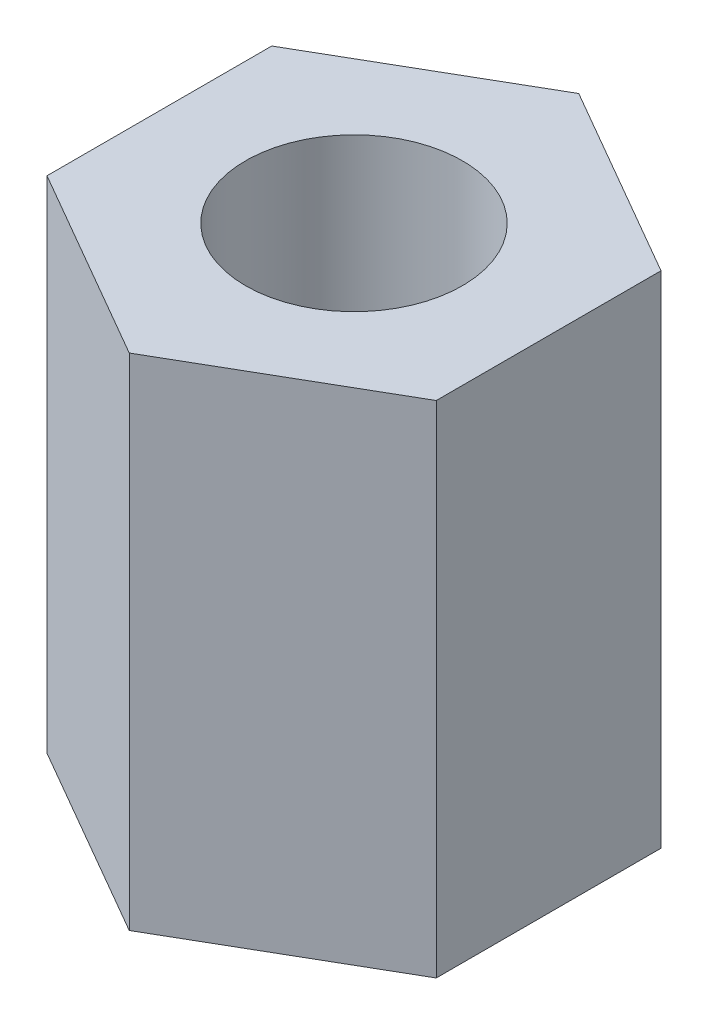
ISO-10303-21;
HEADER;
FILE_DESCRIPTION(('STEP AP214'),'2;1');
FILE_NAME('part.step','',(''),(''),'','','');
FILE_SCHEMA(('AUTOMOTIVE_DESIGN { 1 0 10303 214 1 1 1 1 }'));
ENDSEC;
DATA;
#1=APPLICATION_CONTEXT('core data for automotive mechanical design processes');
#2=APPLICATION_PROTOCOL_DEFINITION('international standard','automotive_design',2000,#1);
#3=PRODUCT_CONTEXT('',#1,'mechanical');
#4=PRODUCT('Part','Part','',(#3));
#5=PRODUCT_RELATED_PRODUCT_CATEGORY('part','',(#4));
#6=PRODUCT_DEFINITION_FORMATION('','',#4);
#7=PRODUCT_DEFINITION_CONTEXT('part definition',#1,'design');
#8=PRODUCT_DEFINITION('design','',#6,#7);
#9=PRODUCT_DEFINITION_SHAPE('','',#8);
#10=(LENGTH_UNIT() NAMED_UNIT(*) SI_UNIT(.MILLI.,.METRE.));
#11=(NAMED_UNIT(*) PLANE_ANGLE_UNIT() SI_UNIT($,.RADIAN.));
#12=(NAMED_UNIT(*) SI_UNIT($,.STERADIAN.) SOLID_ANGLE_UNIT());
#13=UNCERTAINTY_MEASURE_WITH_UNIT(LENGTH_MEASURE(1.E-05),#10,'distance_accuracy_value','');
#14=(GEOMETRIC_REPRESENTATION_CONTEXT(3) GLOBAL_UNCERTAINTY_ASSIGNED_CONTEXT((#13)) GLOBAL_UNIT_ASSIGNED_CONTEXT((#10,
#11,#12)) REPRESENTATION_CONTEXT('',''));
#15=CARTESIAN_POINT('',(0.,0.,0.));
#16=DIRECTION('',(0.,0.,1.));
#17=DIRECTION('',(1.,0.,0.));
#18=AXIS2_PLACEMENT_3D('',#15,#16,#17);
#19=CARTESIAN_POINT('',(0.,6.,0.));
#20=DIRECTION('',(0.,1.,0.));
#21=DIRECTION('',(0.,0.,1.));
#22=AXIS2_PLACEMENT_3D('',#19,#20,#21);
#23=PLANE('',#22);
#24=DIRECTION('',(0.866025403784442,0.,0.499999999999995));
#25=VECTOR('',#24,1.);
#26=CARTESIAN_POINT('',(-2.33499999999999,6.,1.3481128785578));
#27=LINE('',#26,#25);
#28=CARTESIAN_POINT('',(-2.33499999999999,6.,1.3481128785578));
#29=VERTEX_POINT('',#28);
#30=CARTESIAN_POINT('',(0.,6.,2.69622575711555));
#31=VERTEX_POINT('',#30);
#32=EDGE_CURVE('E129',#29,#31,#27,.T.);
#33=ORIENTED_EDGE('',*,*,#32,.T.);
#34=DIRECTION('',(0.866025403784438,0.,-0.500000000000001));
#35=VECTOR('',#34,1.);
#36=CARTESIAN_POINT('',(0.,6.,2.69622575711555));
#37=LINE('',#36,#35);
#38=CARTESIAN_POINT('',(2.335,6.,1.34811287855777));
#39=VERTEX_POINT('',#38);
#40=EDGE_CURVE('E87',#31,#39,#37,.T.);
#41=ORIENTED_EDGE('',*,*,#40,.T.);
#42=DIRECTION('',(0.,0.,-1.));
#43=VECTOR('',#42,1.);
#44=CARTESIAN_POINT('',(2.335,6.,1.34811287855777));
#45=LINE('',#44,#43);
#46=CARTESIAN_POINT('',(2.335,6.,-1.34811287855779));
#47=VERTEX_POINT('',#46);
#48=EDGE_CURVE('E100',#39,#47,#45,.T.);
#49=ORIENTED_EDGE('',*,*,#48,.T.);
#50=DIRECTION('',(-0.866025403784442,0.,-0.499999999999995));
#51=VECTOR('',#50,1.);
#52=CARTESIAN_POINT('',(2.335,6.,-1.34811287855779));
#53=LINE('',#52,#51);
#54=CARTESIAN_POINT('',(0.,6.,-2.69622575711555));
#55=VERTEX_POINT('',#54);
#56=EDGE_CURVE('E94',#47,#55,#53,.T.);
#57=ORIENTED_EDGE('',*,*,#56,.T.);
#58=DIRECTION('',(-0.866025403784434,0.,0.500000000000007));
#59=VECTOR('',#58,1.);
#60=CARTESIAN_POINT('',(0.,6.,-2.69622575711555));
#61=LINE('',#60,#59);
#62=CARTESIAN_POINT('',(-2.33500000000001,6.,-1.34811287855776));
#63=VERTEX_POINT('',#62);
#64=EDGE_CURVE('E98',#55,#63,#61,.T.);
#65=ORIENTED_EDGE('',*,*,#64,.T.);
#66=DIRECTION('',(0.,0.,1.));
#67=VECTOR('',#66,1.);
#68=CARTESIAN_POINT('',(-2.33500000000001,6.,-1.34811287855776));
#69=LINE('',#68,#67);
#70=EDGE_CURVE('E50',#63,#29,#69,.T.);
#71=ORIENTED_EDGE('',*,*,#70,.T.);
#72=EDGE_LOOP('',(#33,#41,#49,#57,#65,#71));
#73=FACE_BOUND('',#72,.T.);
#74=CARTESIAN_POINT('',(0.,6.,0.));
#75=DIRECTION('',(0.,1.,0.));
#76=DIRECTION('',(0.,0.,1.));
#77=AXIS2_PLACEMENT_3D('',#74,#75,#76);
#78=CIRCLE('',#77,1.3);
#79=CARTESIAN_POINT('',(0.,6.,1.3));
#80=VERTEX_POINT('',#79);
#81=EDGE_CURVE('E122',#80,#80,#78,.T.);
#82=ORIENTED_EDGE('',*,*,#81,.F.);
#83=EDGE_LOOP('',(#82));
#84=FACE_BOUND('',#83,.T.);
#85=ADVANCED_FACE('F33',(#73,#84),#23,.T.);
#86=CARTESIAN_POINT('',(0.,0.,0.));
#87=DIRECTION('',(0.,1.,0.));
#88=DIRECTION('',(0.,0.,1.));
#89=AXIS2_PLACEMENT_3D('',#86,#87,#88);
#90=PLANE('',#89);
#91=DIRECTION('',(0.866025403784442,0.,0.499999999999995));
#92=VECTOR('',#91,1.);
#93=CARTESIAN_POINT('',(-2.33499999999999,0.,1.3481128785578));
#94=LINE('',#93,#92);
#95=CARTESIAN_POINT('',(-2.33499999999999,0.,1.3481128785578));
#96=VERTEX_POINT('',#95);
#97=CARTESIAN_POINT('',(0.,0.,2.69622575711555));
#98=VERTEX_POINT('',#97);
#99=EDGE_CURVE('E118',#96,#98,#94,.T.);
#100=ORIENTED_EDGE('',*,*,#99,.F.);
#101=DIRECTION('',(0.,0.,1.));
#102=VECTOR('',#101,1.);
#103=CARTESIAN_POINT('',(-2.33500000000001,0.,-1.34811287855776));
#104=LINE('',#103,#102);
#105=CARTESIAN_POINT('',(-2.33500000000001,0.,-1.34811287855776));
#106=VERTEX_POINT('',#105);
#107=EDGE_CURVE('E79',#106,#96,#104,.T.);
#108=ORIENTED_EDGE('',*,*,#107,.F.);
#109=DIRECTION('',(-0.866025403784434,0.,0.500000000000007));
#110=VECTOR('',#109,1.);
#111=CARTESIAN_POINT('',(0.,0.,-2.69622575711555));
#112=LINE('',#111,#110);
#113=CARTESIAN_POINT('',(0.,0.,-2.69622575711555));
#114=VERTEX_POINT('',#113);
#115=EDGE_CURVE('E73',#114,#106,#112,.T.);
#116=ORIENTED_EDGE('',*,*,#115,.F.);
#117=DIRECTION('',(-0.866025403784442,0.,-0.499999999999995));
#118=VECTOR('',#117,1.);
#119=CARTESIAN_POINT('',(2.335,0.,-1.34811287855779));
#120=LINE('',#119,#118);
#121=CARTESIAN_POINT('',(2.335,0.,-1.34811287855779));
#122=VERTEX_POINT('',#121);
#123=EDGE_CURVE('E108',#122,#114,#120,.T.);
#124=ORIENTED_EDGE('',*,*,#123,.F.);
#125=DIRECTION('',(0.,0.,-1.));
#126=VECTOR('',#125,1.);
#127=CARTESIAN_POINT('',(2.335,0.,1.34811287855777));
#128=LINE('',#127,#126);
#129=CARTESIAN_POINT('',(2.335,0.,1.34811287855777));
#130=VERTEX_POINT('',#129);
#131=EDGE_CURVE('E124',#130,#122,#128,.T.);
#132=ORIENTED_EDGE('',*,*,#131,.F.);
#133=DIRECTION('',(0.866025403784438,0.,-0.500000000000001));
#134=VECTOR('',#133,1.);
#135=CARTESIAN_POINT('',(0.,0.,2.69622575711555));
#136=LINE('',#135,#134);
#137=EDGE_CURVE('E121',#98,#130,#136,.T.);
#138=ORIENTED_EDGE('',*,*,#137,.F.);
#139=EDGE_LOOP('',(#100,#108,#116,#124,#132,#138));
#140=FACE_BOUND('',#139,.T.);
#141=CARTESIAN_POINT('',(0.,0.,0.));
#142=DIRECTION('',(0.,1.,0.));
#143=DIRECTION('',(0.,0.,1.));
#144=AXIS2_PLACEMENT_3D('',#141,#142,#143);
#145=CIRCLE('',#144,1.3);
#146=CARTESIAN_POINT('',(0.,0.,1.3));
#147=VERTEX_POINT('',#146);
#148=EDGE_CURVE('E222',#147,#147,#145,.T.);
#149=ORIENTED_EDGE('',*,*,#148,.T.);
#150=EDGE_LOOP('',(#149));
#151=FACE_BOUND('',#150,.T.);
#152=ADVANCED_FACE('F138',(#140,#151),#90,.F.);
#153=CARTESIAN_POINT('',(-2.33499999999999,6.,1.3481128785578));
#154=DIRECTION('',(0.499999999999995,0.,-0.866025403784441));
#155=DIRECTION('',(-0.866025403784442,0.,-0.499999999999995));
#156=AXIS2_PLACEMENT_3D('',#153,#154,#155);
#157=PLANE('',#156);
#158=ORIENTED_EDGE('',*,*,#99,.T.);
#159=DIRECTION('',(0.,-1.,0.));
#160=VECTOR('',#159,1.);
#161=CARTESIAN_POINT('',(0.,6.,2.69622575711555));
#162=LINE('',#161,#160);
#163=EDGE_CURVE('E11',#31,#98,#162,.T.);
#164=ORIENTED_EDGE('',*,*,#163,.F.);
#165=ORIENTED_EDGE('',*,*,#32,.F.);
#166=DIRECTION('',(0.,-1.,0.));
#167=VECTOR('',#166,1.);
#168=CARTESIAN_POINT('',(-2.33499999999999,6.,1.3481128785578));
#169=LINE('',#168,#167);
#170=EDGE_CURVE('E114',#29,#96,#169,.T.);
#171=ORIENTED_EDGE('',*,*,#170,.T.);
#172=EDGE_LOOP('',(#158,#164,#165,#171));
#173=FACE_BOUND('',#172,.T.);
#174=ADVANCED_FACE('F35',(#173),#157,.F.);
#175=CARTESIAN_POINT('',(0.,6.,2.69622575711555));
#176=DIRECTION('',(-0.500000000000001,0.,-0.866025403784438));
#177=DIRECTION('',(-0.866025403784438,0.,0.500000000000001));
#178=AXIS2_PLACEMENT_3D('',#175,#176,#177);
#179=PLANE('',#178);
#180=ORIENTED_EDGE('',*,*,#137,.T.);
#181=DIRECTION('',(0.,-1.,0.));
#182=VECTOR('',#181,1.);
#183=CARTESIAN_POINT('',(2.335,6.,1.34811287855777));
#184=LINE('',#183,#182);
#185=EDGE_CURVE('E42',#39,#130,#184,.T.);
#186=ORIENTED_EDGE('',*,*,#185,.F.);
#187=ORIENTED_EDGE('',*,*,#40,.F.);
#188=ORIENTED_EDGE('',*,*,#163,.T.);
#189=EDGE_LOOP('',(#180,#186,#187,#188));
#190=FACE_BOUND('',#189,.T.);
#191=ADVANCED_FACE('F163',(#190),#179,.F.);
#192=CARTESIAN_POINT('',(2.335,6.,1.34811287855777));
#193=DIRECTION('',(-1.,0.,0.));
#194=DIRECTION('',(0.,0.,1.));
#195=AXIS2_PLACEMENT_3D('',#192,#193,#194);
#196=PLANE('',#195);
#197=ORIENTED_EDGE('',*,*,#131,.T.);
#198=DIRECTION('',(0.,-1.,0.));
#199=VECTOR('',#198,1.);
#200=CARTESIAN_POINT('',(2.335,6.,-1.34811287855779));
#201=LINE('',#200,#199);
#202=EDGE_CURVE('E109',#47,#122,#201,.T.);
#203=ORIENTED_EDGE('',*,*,#202,.F.);
#204=ORIENTED_EDGE('',*,*,#48,.F.);
#205=ORIENTED_EDGE('',*,*,#185,.T.);
#206=EDGE_LOOP('',(#197,#203,#204,#205));
#207=FACE_BOUND('',#206,.T.);
#208=ADVANCED_FACE('F135',(#207),#196,.F.);
#209=CARTESIAN_POINT('',(2.335,6.,-1.34811287855779));
#210=DIRECTION('',(-0.499999999999995,0.,0.866025403784441));
#211=DIRECTION('',(0.866025403784442,0.,0.499999999999995));
#212=AXIS2_PLACEMENT_3D('',#209,#210,#211);
#213=PLANE('',#212);
#214=ORIENTED_EDGE('',*,*,#123,.T.);
#215=DIRECTION('',(0.,-1.,0.));
#216=VECTOR('',#215,1.);
#217=CARTESIAN_POINT('',(0.,6.,-2.69622575711555));
#218=LINE('',#217,#216);
#219=EDGE_CURVE('E105',#55,#114,#218,.T.);
#220=ORIENTED_EDGE('',*,*,#219,.F.);
#221=ORIENTED_EDGE('',*,*,#56,.F.);
#222=ORIENTED_EDGE('',*,*,#202,.T.);
#223=EDGE_LOOP('',(#214,#220,#221,#222));
#224=FACE_BOUND('',#223,.T.);
#225=ADVANCED_FACE('F106',(#224),#213,.F.);
#226=CARTESIAN_POINT('',(0.,6.,-2.69622575711555));
#227=DIRECTION('',(0.500000000000007,0.,0.866025403784435));
#228=DIRECTION('',(0.866025403784434,0.,-0.500000000000007));
#229=AXIS2_PLACEMENT_3D('',#226,#227,#228);
#230=PLANE('',#229);
#231=ORIENTED_EDGE('',*,*,#115,.T.);
#232=DIRECTION('',(0.,-1.,0.));
#233=VECTOR('',#232,1.);
#234=CARTESIAN_POINT('',(-2.33500000000001,6.,-1.34811287855776));
#235=LINE('',#234,#233);
#236=EDGE_CURVE('E110',#63,#106,#235,.T.);
#237=ORIENTED_EDGE('',*,*,#236,.F.);
#238=ORIENTED_EDGE('',*,*,#64,.F.);
#239=ORIENTED_EDGE('',*,*,#219,.T.);
#240=EDGE_LOOP('',(#231,#237,#238,#239));
#241=FACE_BOUND('',#240,.T.);
#242=ADVANCED_FACE('F112',(#241),#230,.F.);
#243=CARTESIAN_POINT('',(-2.33500000000001,6.,-1.34811287855776));
#244=DIRECTION('',(1.,0.,0.));
#245=DIRECTION('',(0.,0.,-1.));
#246=AXIS2_PLACEMENT_3D('',#243,#244,#245);
#247=PLANE('',#246);
#248=ORIENTED_EDGE('',*,*,#107,.T.);
#249=ORIENTED_EDGE('',*,*,#170,.F.);
#250=ORIENTED_EDGE('',*,*,#70,.F.);
#251=ORIENTED_EDGE('',*,*,#236,.T.);
#252=EDGE_LOOP('',(#248,#249,#250,#251));
#253=FACE_BOUND('',#252,.T.);
#254=ADVANCED_FACE('F143',(#253),#247,.F.);
#255=CARTESIAN_POINT('',(0.,6.,0.));
#256=DIRECTION('',(0.,-1.,0.));
#257=DIRECTION('',(0.,0.,-1.));
#258=AXIS2_PLACEMENT_3D('',#255,#256,#257);
#259=CYLINDRICAL_SURFACE('',#258,1.3);
#260=ORIENTED_EDGE('',*,*,#81,.T.);
#261=EDGE_LOOP('',(#260));
#262=FACE_BOUND('',#261,.T.);
#263=ORIENTED_EDGE('',*,*,#148,.F.);
#264=EDGE_LOOP('',(#263));
#265=FACE_BOUND('',#264,.T.);
#266=ADVANCED_FACE('F145',(#262,#265),#259,.F.);
#267=CLOSED_SHELL('',(#85,#152,#174,#191,#208,#225,#242,#254,#266));
#268=MANIFOLD_SOLID_BREP('B2',#267);
#269=ADVANCED_BREP_SHAPE_REPRESENTATION('',(#18,#268),#14);
#270=SHAPE_DEFINITION_REPRESENTATION(#9,#269);
ENDSEC;
END-ISO-10303-21;
